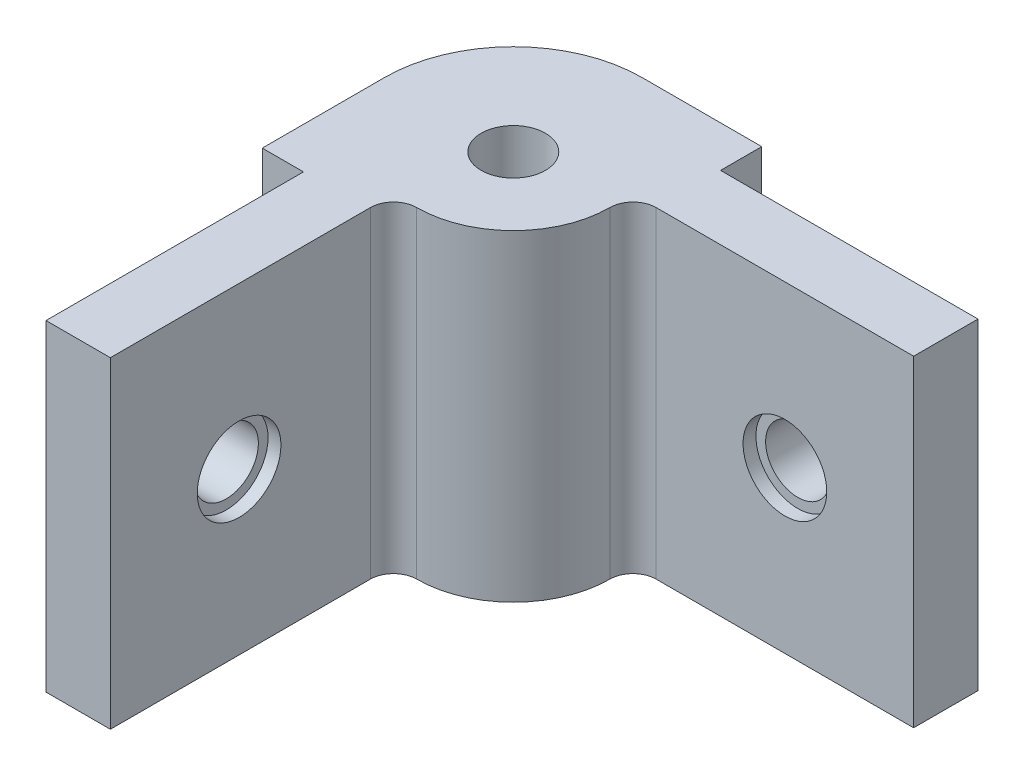
ISO-10303-21;
HEADER;
FILE_DESCRIPTION(('STEP AP214'),'2;1');
FILE_NAME('part.step','',(''),(''),'','','');
FILE_SCHEMA(('AUTOMOTIVE_DESIGN { 1 0 10303 214 1 1 1 1 }'));
ENDSEC;
DATA;
#1=APPLICATION_CONTEXT('core data for automotive mechanical design processes');
#2=APPLICATION_PROTOCOL_DEFINITION('international standard','automotive_design',2000,#1);
#3=PRODUCT_CONTEXT('',#1,'mechanical');
#4=PRODUCT('Part','Part','',(#3));
#5=PRODUCT_RELATED_PRODUCT_CATEGORY('part','',(#4));
#6=PRODUCT_DEFINITION_FORMATION('','',#4);
#7=PRODUCT_DEFINITION_CONTEXT('part definition',#1,'design');
#8=PRODUCT_DEFINITION('design','',#6,#7);
#9=PRODUCT_DEFINITION_SHAPE('','',#8);
#10=(LENGTH_UNIT() NAMED_UNIT(*) SI_UNIT(.MILLI.,.METRE.));
#11=(NAMED_UNIT(*) PLANE_ANGLE_UNIT() SI_UNIT($,.RADIAN.));
#12=(NAMED_UNIT(*) SI_UNIT($,.STERADIAN.) SOLID_ANGLE_UNIT());
#13=UNCERTAINTY_MEASURE_WITH_UNIT(LENGTH_MEASURE(1.E-05),#10,'distance_accuracy_value','');
#14=(GEOMETRIC_REPRESENTATION_CONTEXT(3) GLOBAL_UNCERTAINTY_ASSIGNED_CONTEXT((#13)) GLOBAL_UNIT_ASSIGNED_CONTEXT((#10,
#11,#12)) REPRESENTATION_CONTEXT('',''));
#15=CARTESIAN_POINT('',(0.,0.,0.));
#16=DIRECTION('',(0.,0.,1.));
#17=DIRECTION('',(1.,0.,0.));
#18=AXIS2_PLACEMENT_3D('',#15,#16,#17);
#19=CARTESIAN_POINT('',(-6.44034826133112,12.5,6.99883601694872));
#20=DIRECTION('',(1.,0.,0.));
#21=DIRECTION('',(0.,0.,-1.));
#22=AXIS2_PLACEMENT_3D('',#19,#20,#21);
#23=CYLINDRICAL_SURFACE('',#22,2.5);
#24=CARTESIAN_POINT('',(-3.24034826133112,12.5,6.99883601694872));
#25=DIRECTION('',(1.,0.,0.));
#26=DIRECTION('',(0.,0.,-1.));
#27=AXIS2_PLACEMENT_3D('',#24,#25,#26);
#28=CIRCLE('',#27,2.5);
#29=CARTESIAN_POINT('',(-3.24034826133112,12.5,4.49883601694872));
#30=VERTEX_POINT('',#29);
#31=EDGE_CURVE('E241',#30,#30,#28,.T.);
#32=ORIENTED_EDGE('',*,*,#31,.F.);
#33=EDGE_LOOP('',(#32));
#34=FACE_BOUND('',#33,.T.);
#35=CARTESIAN_POINT('',(0.759651738668881,12.5,6.99883601694872));
#36=DIRECTION('',(1.,0.,0.));
#37=DIRECTION('',(0.,0.,-1.));
#38=AXIS2_PLACEMENT_3D('',#35,#36,#37);
#39=CIRCLE('',#38,2.5);
#40=CARTESIAN_POINT('',(0.759651738668881,12.5,4.49883601694872));
#41=VERTEX_POINT('',#40);
#42=EDGE_CURVE('E38',#41,#41,#39,.F.);
#43=ORIENTED_EDGE('',*,*,#42,.F.);
#44=EDGE_LOOP('',(#43));
#45=FACE_BOUND('',#44,.T.);
#46=ADVANCED_FACE('F34',(#34,#45),#23,.F.);
#47=CARTESIAN_POINT('',(22.8596517386988,12.5,16.9988360169487));
#48=DIRECTION('',(0.,0.,-1.));
#49=DIRECTION('',(-1.,0.,0.));
#50=AXIS2_PLACEMENT_3D('',#47,#48,#49);
#51=CYLINDRICAL_SURFACE('',#50,2.50000000000001);
#52=CARTESIAN_POINT('',(22.8596517386988,12.5,-19.3011639830492));
#53=DIRECTION('',(0.,0.,-1.));
#54=DIRECTION('',(-1.,0.,0.));
#55=AXIS2_PLACEMENT_3D('',#52,#53,#54);
#56=CIRCLE('',#55,2.50000000000001);
#57=CARTESIAN_POINT('',(20.3596517386988,12.5,-19.3011639830492));
#58=VERTEX_POINT('',#57);
#59=EDGE_CURVE('E228',#58,#58,#56,.T.);
#60=ORIENTED_EDGE('',*,*,#59,.T.);
#61=EDGE_LOOP('',(#60));
#62=FACE_BOUND('',#61,.T.);
#63=CARTESIAN_POINT('',(22.8596517386988,12.5,-15.3011639830541));
#64=DIRECTION('',(0.,0.,1.));
#65=DIRECTION('',(1.,0.,0.));
#66=AXIS2_PLACEMENT_3D('',#63,#64,#65);
#67=CIRCLE('',#66,2.50000000000001);
#68=CARTESIAN_POINT('',(25.3596517386988,12.5,-15.3011639830541));
#69=VERTEX_POINT('',#68);
#70=EDGE_CURVE('E226',#69,#69,#67,.F.);
#71=ORIENTED_EDGE('',*,*,#70,.F.);
#72=EDGE_LOOP('',(#71));
#73=FACE_BOUND('',#72,.T.);
#74=ADVANCED_FACE('F299',(#62,#73),#51,.F.);
#75=CARTESIAN_POINT('',(3.55965173866673,25.,-3.20116398305856));
#76=DIRECTION('',(0.,1.,0.));
#77=DIRECTION('',(0.,0.,1.));
#78=AXIS2_PLACEMENT_3D('',#75,#76,#77);
#79=PLANE('',#78);
#80=DIRECTION('',(1.,0.,0.));
#81=VECTOR('',#80,1.);
#82=CARTESIAN_POINT('',(-6.44034826133112,25.,-3.00116398305128));
#83=LINE('',#82,#81);
#84=CARTESIAN_POINT('',(-6.44034826133112,25.,-3.00116398305128));
#85=VERTEX_POINT('',#84);
#86=CARTESIAN_POINT('',(-3.24034826133112,25.,-3.00116398305128));
#87=VERTEX_POINT('',#86);
#88=EDGE_CURVE('E197',#85,#87,#83,.T.);
#89=ORIENTED_EDGE('',*,*,#88,.T.);
#90=DIRECTION('',(0.,0.,1.));
#91=VECTOR('',#90,1.);
#92=CARTESIAN_POINT('',(-3.24034826133112,25.,-3.00116398305128));
#93=LINE('',#92,#91);
#94=CARTESIAN_POINT('',(-3.24034826133112,25.,16.9988360169487));
#95=VERTEX_POINT('',#94);
#96=EDGE_CURVE('E114',#87,#95,#93,.T.);
#97=ORIENTED_EDGE('',*,*,#96,.T.);
#98=DIRECTION('',(1.,0.,0.));
#99=VECTOR('',#98,1.);
#100=CARTESIAN_POINT('',(-3.24034826133112,25.,16.9988360169487));
#101=LINE('',#100,#99);
#102=CARTESIAN_POINT('',(1.75965173866888,25.,16.9988360169487));
#103=VERTEX_POINT('',#102);
#104=EDGE_CURVE('E252',#95,#103,#101,.T.);
#105=ORIENTED_EDGE('',*,*,#104,.T.);
#106=DIRECTION('',(0.,0.,-1.));
#107=VECTOR('',#106,1.);
#108=CARTESIAN_POINT('',(1.75965173866888,25.,-3.20116398305856));
#109=LINE('',#108,#107);
#110=CARTESIAN_POINT('',(1.75965173866888,25.,-3.20116398305856));
#111=VERTEX_POINT('',#110);
#112=EDGE_CURVE('E254',#103,#111,#109,.T.);
#113=ORIENTED_EDGE('',*,*,#112,.T.);
#114=CARTESIAN_POINT('',(3.55965173866673,25.,-3.20116398305856));
#115=DIRECTION('',(0.,-1.,0.));
#116=DIRECTION('',(0.,0.,1.));
#117=AXIS2_PLACEMENT_3D('',#114,#115,#116);
#118=CIRCLE('',#117,1.79999999999785);
#119=CARTESIAN_POINT('',(3.55965173866673,25.,-5.00116398305641));
#120=VERTEX_POINT('',#119);
#121=EDGE_CURVE('E256',#111,#120,#118,.T.);
#122=ORIENTED_EDGE('',*,*,#121,.T.);
#123=CARTESIAN_POINT('',(3.55965173866673,25.,-12.5011639830562));
#124=DIRECTION('',(0.,1.,0.));
#125=DIRECTION('',(0.,0.,-1.));
#126=AXIS2_PLACEMENT_3D('',#123,#124,#125);
#127=CIRCLE('',#126,7.49999999999982);
#128=CARTESIAN_POINT('',(11.0596517386666,25.,-12.5011639830562));
#129=VERTEX_POINT('',#128);
#130=EDGE_CURVE('E258',#120,#129,#127,.T.);
#131=ORIENTED_EDGE('',*,*,#130,.T.);
#132=CARTESIAN_POINT('',(12.8596517386644,25.,-12.5011639830562));
#133=DIRECTION('',(0.,-1.,0.));
#134=DIRECTION('',(0.,0.,-1.));
#135=AXIS2_PLACEMENT_3D('',#132,#133,#134);
#136=CIRCLE('',#135,1.79999999999785);
#137=CARTESIAN_POINT('',(12.8596517386644,25.,-14.3011639830541));
#138=VERTEX_POINT('',#137);
#139=EDGE_CURVE('E260',#129,#138,#136,.T.);
#140=ORIENTED_EDGE('',*,*,#139,.T.);
#141=DIRECTION('',(1.,0.,0.));
#142=VECTOR('',#141,1.);
#143=CARTESIAN_POINT('',(12.8596517386644,25.,-14.3011639830541));
#144=LINE('',#143,#142);
#145=CARTESIAN_POINT('',(32.8596517386987,25.,-14.3011639830541));
#146=VERTEX_POINT('',#145);
#147=EDGE_CURVE('E262',#138,#146,#144,.T.);
#148=ORIENTED_EDGE('',*,*,#147,.T.);
#149=DIRECTION('',(0.,0.,-1.));
#150=VECTOR('',#149,1.);
#151=CARTESIAN_POINT('',(32.8596517386987,25.,-19.3011639830492));
#152=LINE('',#151,#150);
#153=CARTESIAN_POINT('',(32.8596517386987,25.,-19.3011639830492));
#154=VERTEX_POINT('',#153);
#155=EDGE_CURVE('E264',#146,#154,#152,.T.);
#156=ORIENTED_EDGE('',*,*,#155,.T.);
#157=DIRECTION('',(-1.,0.,0.));
#158=VECTOR('',#157,1.);
#159=CARTESIAN_POINT('',(12.8596517386989,25.,-19.3011639830492));
#160=LINE('',#159,#158);
#161=CARTESIAN_POINT('',(12.8596517386989,25.,-19.3011639830492));
#162=VERTEX_POINT('',#161);
#163=EDGE_CURVE('E266',#154,#162,#160,.T.);
#164=ORIENTED_EDGE('',*,*,#163,.T.);
#165=DIRECTION('',(0.,0.,-1.));
#166=VECTOR('',#165,1.);
#167=CARTESIAN_POINT('',(12.8596517386989,25.,-22.5011639830541));
#168=LINE('',#167,#166);
#169=CARTESIAN_POINT('',(12.8596517386989,25.,-22.5011639830541));
#170=VERTEX_POINT('',#169);
#171=EDGE_CURVE('E152',#162,#170,#168,.T.);
#172=ORIENTED_EDGE('',*,*,#171,.T.);
#173=DIRECTION('',(-1.,0.,0.));
#174=VECTOR('',#173,1.);
#175=CARTESIAN_POINT('',(3.55965173866673,25.,-22.5011639830541));
#176=LINE('',#175,#174);
#177=CARTESIAN_POINT('',(3.55965173866673,25.,-22.5011639830541));
#178=VERTEX_POINT('',#177);
#179=EDGE_CURVE('E145',#170,#178,#176,.T.);
#180=ORIENTED_EDGE('',*,*,#179,.T.);
#181=CARTESIAN_POINT('',(3.55965173866673,25.,-12.5011639830562));
#182=DIRECTION('',(0.,1.,0.));
#183=DIRECTION('',(0.,0.,1.));
#184=AXIS2_PLACEMENT_3D('',#181,#182,#183);
#185=CIRCLE('',#184,9.99999999999785);
#186=CARTESIAN_POINT('',(-6.44034826133112,25.,-12.5011639830562));
#187=VERTEX_POINT('',#186);
#188=EDGE_CURVE('E150',#178,#187,#185,.T.);
#189=ORIENTED_EDGE('',*,*,#188,.T.);
#190=DIRECTION('',(0.,0.,1.));
#191=VECTOR('',#190,1.);
#192=CARTESIAN_POINT('',(-6.44034826133112,25.,-12.5011639830562));
#193=LINE('',#192,#191);
#194=EDGE_CURVE('E53',#187,#85,#193,.T.);
#195=ORIENTED_EDGE('',*,*,#194,.T.);
#196=EDGE_LOOP('',(#89,#97,#105,#113,#122,#131,#140,#148,#156,#164,#172,#180,#189,#195));
#197=FACE_BOUND('',#196,.T.);
#198=CARTESIAN_POINT('',(3.55965173866673,25.,-12.5011639830562));
#199=DIRECTION('',(0.,1.,0.));
#200=DIRECTION('',(0.,0.,1.));
#201=AXIS2_PLACEMENT_3D('',#198,#199,#200);
#202=CIRCLE('',#201,2.50000000000224);
#203=CARTESIAN_POINT('',(3.55965173866673,25.,-10.001163983054));
#204=VERTEX_POINT('',#203);
#205=EDGE_CURVE('E174',#204,#204,#202,.T.);
#206=ORIENTED_EDGE('',*,*,#205,.F.);
#207=EDGE_LOOP('',(#206));
#208=FACE_BOUND('',#207,.T.);
#209=ADVANCED_FACE('F147',(#197,#208),#79,.T.);
#210=CARTESIAN_POINT('',(3.55965173866673,0.,-3.20116398305856));
#211=DIRECTION('',(0.,1.,0.));
#212=DIRECTION('',(0.,0.,1.));
#213=AXIS2_PLACEMENT_3D('',#210,#211,#212);
#214=PLANE('',#213);
#215=DIRECTION('',(1.,0.,0.));
#216=VECTOR('',#215,1.);
#217=CARTESIAN_POINT('',(-6.44034826133112,0.,-3.00116398305128));
#218=LINE('',#217,#216);
#219=CARTESIAN_POINT('',(-6.44034826133112,0.,-3.00116398305128));
#220=VERTEX_POINT('',#219);
#221=CARTESIAN_POINT('',(-3.24034826133112,0.,-3.00116398305128));
#222=VERTEX_POINT('',#221);
#223=EDGE_CURVE('E170',#220,#222,#218,.T.);
#224=ORIENTED_EDGE('',*,*,#223,.F.);
#225=DIRECTION('',(0.,0.,1.));
#226=VECTOR('',#225,1.);
#227=CARTESIAN_POINT('',(-6.44034826133112,0.,-12.5011639830562));
#228=LINE('',#227,#226);
#229=CARTESIAN_POINT('',(-6.44034826133112,0.,-12.5011639830562));
#230=VERTEX_POINT('',#229);
#231=EDGE_CURVE('E106',#230,#220,#228,.T.);
#232=ORIENTED_EDGE('',*,*,#231,.F.);
#233=CARTESIAN_POINT('',(3.55965173866673,0.,-12.5011639830562));
#234=DIRECTION('',(0.,1.,0.));
#235=DIRECTION('',(0.,0.,1.));
#236=AXIS2_PLACEMENT_3D('',#233,#234,#235);
#237=CIRCLE('',#236,9.99999999999785);
#238=CARTESIAN_POINT('',(3.55965173866673,0.,-22.5011639830541));
#239=VERTEX_POINT('',#238);
#240=EDGE_CURVE('E100',#239,#230,#237,.T.);
#241=ORIENTED_EDGE('',*,*,#240,.F.);
#242=DIRECTION('',(-1.,0.,0.));
#243=VECTOR('',#242,1.);
#244=CARTESIAN_POINT('',(3.55965173866673,0.,-22.5011639830541));
#245=LINE('',#244,#243);
#246=CARTESIAN_POINT('',(12.8596517386989,0.,-22.5011639830541));
#247=VERTEX_POINT('',#246);
#248=EDGE_CURVE('E160',#247,#239,#245,.T.);
#249=ORIENTED_EDGE('',*,*,#248,.F.);
#250=DIRECTION('',(0.,0.,-1.));
#251=VECTOR('',#250,1.);
#252=CARTESIAN_POINT('',(12.8596517386989,0.,-22.5011639830541));
#253=LINE('',#252,#251);
#254=CARTESIAN_POINT('',(12.8596517386989,0.,-19.3011639830492));
#255=VERTEX_POINT('',#254);
#256=EDGE_CURVE('E192',#255,#247,#253,.T.);
#257=ORIENTED_EDGE('',*,*,#256,.F.);
#258=DIRECTION('',(-1.,0.,0.));
#259=VECTOR('',#258,1.);
#260=CARTESIAN_POINT('',(12.8596517386989,0.,-19.3011639830492));
#261=LINE('',#260,#259);
#262=CARTESIAN_POINT('',(32.8596517386987,0.,-19.3011639830492));
#263=VERTEX_POINT('',#262);
#264=EDGE_CURVE('E190',#263,#255,#261,.T.);
#265=ORIENTED_EDGE('',*,*,#264,.F.);
#266=DIRECTION('',(0.,0.,-1.));
#267=VECTOR('',#266,1.);
#268=CARTESIAN_POINT('',(32.8596517386987,0.,-19.3011639830492));
#269=LINE('',#268,#267);
#270=CARTESIAN_POINT('',(32.8596517386987,0.,-14.3011639830541));
#271=VERTEX_POINT('',#270);
#272=EDGE_CURVE('E188',#271,#263,#269,.T.);
#273=ORIENTED_EDGE('',*,*,#272,.F.);
#274=DIRECTION('',(1.,0.,0.));
#275=VECTOR('',#274,1.);
#276=CARTESIAN_POINT('',(12.8596517386644,0.,-14.3011639830541));
#277=LINE('',#276,#275);
#278=CARTESIAN_POINT('',(12.8596517386644,0.,-14.3011639830541));
#279=VERTEX_POINT('',#278);
#280=EDGE_CURVE('E186',#279,#271,#277,.T.);
#281=ORIENTED_EDGE('',*,*,#280,.F.);
#282=CARTESIAN_POINT('',(12.8596517386644,0.,-12.5011639830562));
#283=DIRECTION('',(0.,-1.,0.));
#284=DIRECTION('',(0.,0.,-1.));
#285=AXIS2_PLACEMENT_3D('',#282,#283,#284);
#286=CIRCLE('',#285,1.79999999999785);
#287=CARTESIAN_POINT('',(11.0596517386666,0.,-12.5011639830562));
#288=VERTEX_POINT('',#287);
#289=EDGE_CURVE('E184',#288,#279,#286,.T.);
#290=ORIENTED_EDGE('',*,*,#289,.F.);
#291=CARTESIAN_POINT('',(3.55965173866673,0.,-12.5011639830562));
#292=DIRECTION('',(0.,1.,0.));
#293=DIRECTION('',(0.,0.,-1.));
#294=AXIS2_PLACEMENT_3D('',#291,#292,#293);
#295=CIRCLE('',#294,7.49999999999982);
#296=CARTESIAN_POINT('',(3.55965173866673,0.,-5.00116398305641));
#297=VERTEX_POINT('',#296);
#298=EDGE_CURVE('E182',#297,#288,#295,.T.);
#299=ORIENTED_EDGE('',*,*,#298,.F.);
#300=CARTESIAN_POINT('',(3.55965173866673,0.,-3.20116398305856));
#301=DIRECTION('',(0.,-1.,0.));
#302=DIRECTION('',(0.,0.,1.));
#303=AXIS2_PLACEMENT_3D('',#300,#301,#302);
#304=CIRCLE('',#303,1.79999999999785);
#305=CARTESIAN_POINT('',(1.75965173866888,0.,-3.20116398305856));
#306=VERTEX_POINT('',#305);
#307=EDGE_CURVE('E180',#306,#297,#304,.T.);
#308=ORIENTED_EDGE('',*,*,#307,.F.);
#309=DIRECTION('',(0.,0.,-1.));
#310=VECTOR('',#309,1.);
#311=CARTESIAN_POINT('',(1.75965173866888,0.,-3.20116398305856));
#312=LINE('',#311,#310);
#313=CARTESIAN_POINT('',(1.75965173866888,0.,16.9988360169487));
#314=VERTEX_POINT('',#313);
#315=EDGE_CURVE('E178',#314,#306,#312,.T.);
#316=ORIENTED_EDGE('',*,*,#315,.F.);
#317=DIRECTION('',(1.,0.,0.));
#318=VECTOR('',#317,1.);
#319=CARTESIAN_POINT('',(-3.24034826133112,0.,16.9988360169487));
#320=LINE('',#319,#318);
#321=CARTESIAN_POINT('',(-3.24034826133112,0.,16.9988360169487));
#322=VERTEX_POINT('',#321);
#323=EDGE_CURVE('E176',#322,#314,#320,.T.);
#324=ORIENTED_EDGE('',*,*,#323,.F.);
#325=DIRECTION('',(0.,0.,1.));
#326=VECTOR('',#325,1.);
#327=CARTESIAN_POINT('',(-3.24034826133112,0.,-3.00116398305128));
#328=LINE('',#327,#326);
#329=EDGE_CURVE('E173',#222,#322,#328,.T.);
#330=ORIENTED_EDGE('',*,*,#329,.F.);
#331=EDGE_LOOP('',(#224,#232,#241,#249,#257,#265,#273,#281,#290,#299,#308,#316,#324,#330));
#332=FACE_BOUND('',#331,.T.);
#333=CARTESIAN_POINT('',(3.55965173866673,0.,-12.5011639830562));
#334=DIRECTION('',(0.,1.,0.));
#335=DIRECTION('',(0.,0.,1.));
#336=AXIS2_PLACEMENT_3D('',#333,#334,#335);
#337=CIRCLE('',#336,2.50000000000224);
#338=CARTESIAN_POINT('',(3.55965173866673,0.,-10.001163983054));
#339=VERTEX_POINT('',#338);
#340=EDGE_CURVE('E233',#339,#339,#337,.T.);
#341=ORIENTED_EDGE('',*,*,#340,.T.);
#342=EDGE_LOOP('',(#341));
#343=FACE_BOUND('',#342,.T.);
#344=ADVANCED_FACE('F279',(#332,#343),#214,.F.);
#345=CARTESIAN_POINT('',(-6.44034826133112,25.,-3.00116398305128));
#346=DIRECTION('',(0.,0.,-1.));
#347=DIRECTION('',(-1.,0.,0.));
#348=AXIS2_PLACEMENT_3D('',#345,#346,#347);
#349=PLANE('',#348);
#350=ORIENTED_EDGE('',*,*,#223,.T.);
#351=DIRECTION('',(0.,-1.,0.));
#352=VECTOR('',#351,1.);
#353=CARTESIAN_POINT('',(-3.24034826133112,25.,-3.00116398305128));
#354=LINE('',#353,#352);
#355=EDGE_CURVE('E11',#87,#222,#354,.T.);
#356=ORIENTED_EDGE('',*,*,#355,.F.);
#357=ORIENTED_EDGE('',*,*,#88,.F.);
#358=DIRECTION('',(0.,-1.,0.));
#359=VECTOR('',#358,1.);
#360=CARTESIAN_POINT('',(-6.44034826133112,25.,-3.00116398305128));
#361=LINE('',#360,#359);
#362=EDGE_CURVE('E166',#85,#220,#361,.T.);
#363=ORIENTED_EDGE('',*,*,#362,.T.);
#364=EDGE_LOOP('',(#350,#356,#357,#363));
#365=FACE_BOUND('',#364,.T.);
#366=ADVANCED_FACE('F36',(#365),#349,.F.);
#367=CARTESIAN_POINT('',(-3.24034826133112,25.,-3.00116398305128));
#368=DIRECTION('',(1.,0.,0.));
#369=DIRECTION('',(0.,0.,-1.));
#370=AXIS2_PLACEMENT_3D('',#367,#368,#369);
#371=PLANE('',#370);
#372=ORIENTED_EDGE('',*,*,#31,.T.);
#373=EDGE_LOOP('',(#372));
#374=FACE_BOUND('',#373,.T.);
#375=ORIENTED_EDGE('',*,*,#329,.T.);
#376=DIRECTION('',(0.,-1.,0.));
#377=VECTOR('',#376,1.);
#378=CARTESIAN_POINT('',(-3.24034826133112,25.,16.9988360169487));
#379=LINE('',#378,#377);
#380=EDGE_CURVE('E44',#95,#322,#379,.T.);
#381=ORIENTED_EDGE('',*,*,#380,.F.);
#382=ORIENTED_EDGE('',*,*,#96,.F.);
#383=ORIENTED_EDGE('',*,*,#355,.T.);
#384=EDGE_LOOP('',(#375,#381,#382,#383));
#385=FACE_BOUND('',#384,.T.);
#386=ADVANCED_FACE('F325',(#374,#385),#371,.F.);
#387=CARTESIAN_POINT('',(-3.24034826133112,25.,16.9988360169487));
#388=DIRECTION('',(0.,0.,-1.));
#389=DIRECTION('',(-1.,0.,0.));
#390=AXIS2_PLACEMENT_3D('',#387,#388,#389);
#391=PLANE('',#390);
#392=ORIENTED_EDGE('',*,*,#323,.T.);
#393=DIRECTION('',(0.,-1.,0.));
#394=VECTOR('',#393,1.);
#395=CARTESIAN_POINT('',(1.75965173866888,25.,16.9988360169487));
#396=LINE('',#395,#394);
#397=EDGE_CURVE('E222',#103,#314,#396,.T.);
#398=ORIENTED_EDGE('',*,*,#397,.F.);
#399=ORIENTED_EDGE('',*,*,#104,.F.);
#400=ORIENTED_EDGE('',*,*,#380,.T.);
#401=EDGE_LOOP('',(#392,#398,#399,#400));
#402=FACE_BOUND('',#401,.T.);
#403=ADVANCED_FACE('F329',(#402),#391,.F.);
#404=CARTESIAN_POINT('',(1.75965173866888,25.,-3.20116398305856));
#405=DIRECTION('',(-1.,0.,0.));
#406=DIRECTION('',(0.,0.,1.));
#407=AXIS2_PLACEMENT_3D('',#404,#405,#406);
#408=PLANE('',#407);
#409=CARTESIAN_POINT('',(1.75965173866888,12.5,6.99883601694872));
#410=DIRECTION('',(1.,0.,0.));
#411=DIRECTION('',(0.,0.,-1.));
#412=AXIS2_PLACEMENT_3D('',#409,#410,#411);
#413=CIRCLE('',#412,3.25);
#414=CARTESIAN_POINT('',(1.75965173866888,12.5,3.74883601694872));
#415=VERTEX_POINT('',#414);
#416=EDGE_CURVE('E462',#415,#415,#413,.T.);
#417=ORIENTED_EDGE('',*,*,#416,.F.);
#418=EDGE_LOOP('',(#417));
#419=FACE_BOUND('',#418,.T.);
#420=ORIENTED_EDGE('',*,*,#315,.T.);
#421=DIRECTION('',(0.,-1.,0.));
#422=VECTOR('',#421,1.);
#423=CARTESIAN_POINT('',(1.75965173866888,25.,-3.20116398305856));
#424=LINE('',#423,#422);
#425=EDGE_CURVE('E219',#111,#306,#424,.T.);
#426=ORIENTED_EDGE('',*,*,#425,.F.);
#427=ORIENTED_EDGE('',*,*,#112,.F.);
#428=ORIENTED_EDGE('',*,*,#397,.T.);
#429=EDGE_LOOP('',(#420,#426,#427,#428));
#430=FACE_BOUND('',#429,.T.);
#431=ADVANCED_FACE('F334',(#419,#430),#408,.F.);
#432=CARTESIAN_POINT('',(3.55965173866673,25.,-3.20116398305856));
#433=DIRECTION('',(0.,-1.,0.));
#434=DIRECTION('',(0.,0.,-1.));
#435=AXIS2_PLACEMENT_3D('',#432,#433,#434);
#436=CYLINDRICAL_SURFACE('',#435,1.79999999999785);
#437=ORIENTED_EDGE('',*,*,#307,.T.);
#438=DIRECTION('',(0.,-1.,0.));
#439=VECTOR('',#438,1.);
#440=CARTESIAN_POINT('',(3.55965173866673,25.,-5.00116398305641));
#441=LINE('',#440,#439);
#442=EDGE_CURVE('E216',#120,#297,#441,.T.);
#443=ORIENTED_EDGE('',*,*,#442,.F.);
#444=ORIENTED_EDGE('',*,*,#121,.F.);
#445=ORIENTED_EDGE('',*,*,#425,.T.);
#446=EDGE_LOOP('',(#437,#443,#444,#445));
#447=FACE_BOUND('',#446,.T.);
#448=ADVANCED_FACE('F341',(#447),#436,.F.);
#449=CARTESIAN_POINT('',(3.55965173866673,25.,-12.5011639830562));
#450=DIRECTION('',(0.,-1.,0.));
#451=DIRECTION('',(0.,0.,-1.));
#452=AXIS2_PLACEMENT_3D('',#449,#450,#451);
#453=CYLINDRICAL_SURFACE('',#452,7.49999999999982);
#454=ORIENTED_EDGE('',*,*,#298,.T.);
#455=DIRECTION('',(0.,-1.,0.));
#456=VECTOR('',#455,1.);
#457=CARTESIAN_POINT('',(11.0596517386666,25.,-12.5011639830562));
#458=LINE('',#457,#456);
#459=EDGE_CURVE('E213',#129,#288,#458,.T.);
#460=ORIENTED_EDGE('',*,*,#459,.F.);
#461=ORIENTED_EDGE('',*,*,#130,.F.);
#462=ORIENTED_EDGE('',*,*,#442,.T.);
#463=EDGE_LOOP('',(#454,#460,#461,#462));
#464=FACE_BOUND('',#463,.T.);
#465=ADVANCED_FACE('F345',(#464),#453,.T.);
#466=CARTESIAN_POINT('',(12.8596517386644,25.,-12.5011639830562));
#467=DIRECTION('',(0.,-1.,0.));
#468=DIRECTION('',(0.,0.,-1.));
#469=AXIS2_PLACEMENT_3D('',#466,#467,#468);
#470=CYLINDRICAL_SURFACE('',#469,1.79999999999785);
#471=ORIENTED_EDGE('',*,*,#289,.T.);
#472=DIRECTION('',(0.,-1.,0.));
#473=VECTOR('',#472,1.);
#474=CARTESIAN_POINT('',(12.8596517386644,25.,-14.3011639830541));
#475=LINE('',#474,#473);
#476=EDGE_CURVE('E210',#138,#279,#475,.T.);
#477=ORIENTED_EDGE('',*,*,#476,.F.);
#478=ORIENTED_EDGE('',*,*,#139,.F.);
#479=ORIENTED_EDGE('',*,*,#459,.T.);
#480=EDGE_LOOP('',(#471,#477,#478,#479));
#481=FACE_BOUND('',#480,.T.);
#482=ADVANCED_FACE('F349',(#481),#470,.F.);
#483=CARTESIAN_POINT('',(12.8596517386644,25.,-14.3011639830541));
#484=DIRECTION('',(0.,0.,-1.));
#485=DIRECTION('',(-1.,0.,0.));
#486=AXIS2_PLACEMENT_3D('',#483,#484,#485);
#487=PLANE('',#486);
#488=CARTESIAN_POINT('',(22.8596517386988,12.5,-14.3011639830541));
#489=DIRECTION('',(0.,0.,1.));
#490=DIRECTION('',(1.,0.,0.));
#491=AXIS2_PLACEMENT_3D('',#488,#489,#490);
#492=CIRCLE('',#491,3.25);
#493=CARTESIAN_POINT('',(26.1096517386988,12.5,-14.3011639830541));
#494=VERTEX_POINT('',#493);
#495=EDGE_CURVE('E236',#494,#494,#492,.T.);
#496=ORIENTED_EDGE('',*,*,#495,.F.);
#497=EDGE_LOOP('',(#496));
#498=FACE_BOUND('',#497,.T.);
#499=ORIENTED_EDGE('',*,*,#280,.T.);
#500=DIRECTION('',(0.,-1.,0.));
#501=VECTOR('',#500,1.);
#502=CARTESIAN_POINT('',(32.8596517386987,25.,-14.3011639830541));
#503=LINE('',#502,#501);
#504=EDGE_CURVE('E207',#146,#271,#503,.T.);
#505=ORIENTED_EDGE('',*,*,#504,.F.);
#506=ORIENTED_EDGE('',*,*,#147,.F.);
#507=ORIENTED_EDGE('',*,*,#476,.T.);
#508=EDGE_LOOP('',(#499,#505,#506,#507));
#509=FACE_BOUND('',#508,.T.);
#510=ADVANCED_FACE('F353',(#498,#509),#487,.F.);
#511=CARTESIAN_POINT('',(32.8596517386987,25.,-19.3011639830492));
#512=DIRECTION('',(-1.,0.,0.));
#513=DIRECTION('',(0.,0.,1.));
#514=AXIS2_PLACEMENT_3D('',#511,#512,#513);
#515=PLANE('',#514);
#516=ORIENTED_EDGE('',*,*,#272,.T.);
#517=DIRECTION('',(0.,-1.,0.));
#518=VECTOR('',#517,1.);
#519=CARTESIAN_POINT('',(32.8596517386987,25.,-19.3011639830492));
#520=LINE('',#519,#518);
#521=EDGE_CURVE('E204',#154,#263,#520,.T.);
#522=ORIENTED_EDGE('',*,*,#521,.F.);
#523=ORIENTED_EDGE('',*,*,#155,.F.);
#524=ORIENTED_EDGE('',*,*,#504,.T.);
#525=EDGE_LOOP('',(#516,#522,#523,#524));
#526=FACE_BOUND('',#525,.T.);
#527=ADVANCED_FACE('F357',(#526),#515,.F.);
#528=CARTESIAN_POINT('',(12.8596517386989,25.,-19.3011639830492));
#529=DIRECTION('',(0.,0.,1.));
#530=DIRECTION('',(1.,0.,0.));
#531=AXIS2_PLACEMENT_3D('',#528,#529,#530);
#532=PLANE('',#531);
#533=ORIENTED_EDGE('',*,*,#59,.F.);
#534=EDGE_LOOP('',(#533));
#535=FACE_BOUND('',#534,.T.);
#536=ORIENTED_EDGE('',*,*,#264,.T.);
#537=DIRECTION('',(0.,-1.,0.));
#538=VECTOR('',#537,1.);
#539=CARTESIAN_POINT('',(12.8596517386989,25.,-19.3011639830492));
#540=LINE('',#539,#538);
#541=EDGE_CURVE('E201',#162,#255,#540,.T.);
#542=ORIENTED_EDGE('',*,*,#541,.F.);
#543=ORIENTED_EDGE('',*,*,#163,.F.);
#544=ORIENTED_EDGE('',*,*,#521,.T.);
#545=EDGE_LOOP('',(#536,#542,#543,#544));
#546=FACE_BOUND('',#545,.T.);
#547=ADVANCED_FACE('F272',(#535,#546),#532,.F.);
#548=CARTESIAN_POINT('',(12.8596517386989,25.,-22.5011639830541));
#549=DIRECTION('',(-1.,0.,0.));
#550=DIRECTION('',(0.,0.,1.));
#551=AXIS2_PLACEMENT_3D('',#548,#549,#550);
#552=PLANE('',#551);
#553=ORIENTED_EDGE('',*,*,#256,.T.);
#554=DIRECTION('',(0.,-1.,0.));
#555=VECTOR('',#554,1.);
#556=CARTESIAN_POINT('',(12.8596517386989,25.,-22.5011639830541));
#557=LINE('',#556,#555);
#558=EDGE_CURVE('E161',#170,#247,#557,.T.);
#559=ORIENTED_EDGE('',*,*,#558,.F.);
#560=ORIENTED_EDGE('',*,*,#171,.F.);
#561=ORIENTED_EDGE('',*,*,#541,.T.);
#562=EDGE_LOOP('',(#553,#559,#560,#561));
#563=FACE_BOUND('',#562,.T.);
#564=ADVANCED_FACE('F276',(#563),#552,.F.);
#565=CARTESIAN_POINT('',(3.55965173866673,25.,-22.5011639830541));
#566=DIRECTION('',(0.,0.,1.));
#567=DIRECTION('',(1.,0.,0.));
#568=AXIS2_PLACEMENT_3D('',#565,#566,#567);
#569=PLANE('',#568);
#570=ORIENTED_EDGE('',*,*,#248,.T.);
#571=DIRECTION('',(0.,-1.,0.));
#572=VECTOR('',#571,1.);
#573=CARTESIAN_POINT('',(3.55965173866673,25.,-22.5011639830541));
#574=LINE('',#573,#572);
#575=EDGE_CURVE('E157',#178,#239,#574,.T.);
#576=ORIENTED_EDGE('',*,*,#575,.F.);
#577=ORIENTED_EDGE('',*,*,#179,.F.);
#578=ORIENTED_EDGE('',*,*,#558,.T.);
#579=EDGE_LOOP('',(#570,#576,#577,#578));
#580=FACE_BOUND('',#579,.T.);
#581=ADVANCED_FACE('F158',(#580),#569,.F.);
#582=CARTESIAN_POINT('',(3.55965173866673,25.,-12.5011639830562));
#583=DIRECTION('',(0.,-1.,0.));
#584=DIRECTION('',(0.,0.,-1.));
#585=AXIS2_PLACEMENT_3D('',#582,#583,#584);
#586=CYLINDRICAL_SURFACE('',#585,9.99999999999785);
#587=ORIENTED_EDGE('',*,*,#240,.T.);
#588=DIRECTION('',(0.,-1.,0.));
#589=VECTOR('',#588,1.);
#590=CARTESIAN_POINT('',(-6.44034826133112,25.,-12.5011639830562));
#591=LINE('',#590,#589);
#592=EDGE_CURVE('E162',#187,#230,#591,.T.);
#593=ORIENTED_EDGE('',*,*,#592,.F.);
#594=ORIENTED_EDGE('',*,*,#188,.F.);
#595=ORIENTED_EDGE('',*,*,#575,.T.);
#596=EDGE_LOOP('',(#587,#593,#594,#595));
#597=FACE_BOUND('',#596,.T.);
#598=ADVANCED_FACE('F164',(#597),#586,.T.);
#599=CARTESIAN_POINT('',(-6.44034826133112,25.,-12.5011639830562));
#600=DIRECTION('',(1.,0.,0.));
#601=DIRECTION('',(0.,0.,-1.));
#602=AXIS2_PLACEMENT_3D('',#599,#600,#601);
#603=PLANE('',#602);
#604=ORIENTED_EDGE('',*,*,#231,.T.);
#605=ORIENTED_EDGE('',*,*,#362,.F.);
#606=ORIENTED_EDGE('',*,*,#194,.F.);
#607=ORIENTED_EDGE('',*,*,#592,.T.);
#608=EDGE_LOOP('',(#604,#605,#606,#607));
#609=FACE_BOUND('',#608,.T.);
#610=ADVANCED_FACE('F285',(#609),#603,.F.);
#611=CARTESIAN_POINT('',(3.55965173866673,25.,-12.5011639830562));
#612=DIRECTION('',(0.,-1.,0.));
#613=DIRECTION('',(0.,0.,-1.));
#614=AXIS2_PLACEMENT_3D('',#611,#612,#613);
#615=CYLINDRICAL_SURFACE('',#614,2.50000000000224);
#616=ORIENTED_EDGE('',*,*,#205,.T.);
#617=EDGE_LOOP('',(#616));
#618=FACE_BOUND('',#617,.T.);
#619=ORIENTED_EDGE('',*,*,#340,.F.);
#620=EDGE_LOOP('',(#619));
#621=FACE_BOUND('',#620,.T.);
#622=ADVANCED_FACE('F287',(#618,#621),#615,.F.);
#623=CARTESIAN_POINT('',(22.8596517386988,12.5,-15.3011639830541));
#624=DIRECTION('',(0.,0.,1.));
#625=DIRECTION('',(1.,0.,0.));
#626=AXIS2_PLACEMENT_3D('',#623,#624,#625);
#627=PLANE('',#626);
#628=CARTESIAN_POINT('',(22.8596517386988,12.5,-15.3011639830541));
#629=DIRECTION('',(0.,0.,1.));
#630=DIRECTION('',(1.,0.,0.));
#631=AXIS2_PLACEMENT_3D('',#628,#629,#630);
#632=CIRCLE('',#631,3.25);
#633=CARTESIAN_POINT('',(26.1096517386988,12.5,-15.3011639830541));
#634=VERTEX_POINT('',#633);
#635=EDGE_CURVE('E229',#634,#634,#632,.T.);
#636=ORIENTED_EDGE('',*,*,#635,.T.);
#637=EDGE_LOOP('',(#636));
#638=FACE_BOUND('',#637,.T.);
#639=ORIENTED_EDGE('',*,*,#70,.T.);
#640=EDGE_LOOP('',(#639));
#641=FACE_BOUND('',#640,.T.);
#642=ADVANCED_FACE('F293',(#638,#641),#627,.T.);
#643=CARTESIAN_POINT('',(22.8596517386988,12.5,-15.3011639830541));
#644=DIRECTION('',(0.,0.,1.));
#645=DIRECTION('',(1.,0.,0.));
#646=AXIS2_PLACEMENT_3D('',#643,#644,#645);
#647=CYLINDRICAL_SURFACE('',#646,3.25);
#648=ORIENTED_EDGE('',*,*,#635,.F.);
#649=EDGE_LOOP('',(#648));
#650=FACE_BOUND('',#649,.T.);
#651=ORIENTED_EDGE('',*,*,#495,.T.);
#652=EDGE_LOOP('',(#651));
#653=FACE_BOUND('',#652,.T.);
#654=ADVANCED_FACE('F315',(#650,#653),#647,.F.);
#655=CARTESIAN_POINT('',(0.759651738668881,12.5,6.99883601694872));
#656=DIRECTION('',(1.,0.,0.));
#657=DIRECTION('',(0.,0.,-1.));
#658=AXIS2_PLACEMENT_3D('',#655,#656,#657);
#659=PLANE('',#658);
#660=CARTESIAN_POINT('',(0.759651738668881,12.5,6.99883601694872));
#661=DIRECTION('',(1.,0.,0.));
#662=DIRECTION('',(0.,0.,-1.));
#663=AXIS2_PLACEMENT_3D('',#660,#661,#662);
#664=CIRCLE('',#663,3.25);
#665=CARTESIAN_POINT('',(0.759651738668881,12.5,3.74883601694872));
#666=VERTEX_POINT('',#665);
#667=EDGE_CURVE('E459',#666,#666,#664,.T.);
#668=ORIENTED_EDGE('',*,*,#667,.T.);
#669=EDGE_LOOP('',(#668));
#670=FACE_BOUND('',#669,.T.);
#671=ORIENTED_EDGE('',*,*,#42,.T.);
#672=EDGE_LOOP('',(#671));
#673=FACE_BOUND('',#672,.T.);
#674=ADVANCED_FACE('F317',(#670,#673),#659,.T.);
#675=CARTESIAN_POINT('',(0.759651738668881,12.5,6.99883601694872));
#676=DIRECTION('',(1.,0.,0.));
#677=DIRECTION('',(0.,0.,-1.));
#678=AXIS2_PLACEMENT_3D('',#675,#676,#677);
#679=CYLINDRICAL_SURFACE('',#678,3.25);
#680=ORIENTED_EDGE('',*,*,#667,.F.);
#681=EDGE_LOOP('',(#680));
#682=FACE_BOUND('',#681,.T.);
#683=ORIENTED_EDGE('',*,*,#416,.T.);
#684=EDGE_LOOP('',(#683));
#685=FACE_BOUND('',#684,.T.);
#686=ADVANCED_FACE('F311',(#682,#685),#679,.F.);
#687=CLOSED_SHELL('',(#46,#74,#209,#344,#366,#386,#403,#431,#448,#465,#482,#510,#527,#547,#564,
#581,#598,#610,#622,#642,#654,#674,#686));
#688=MANIFOLD_SOLID_BREP('B2',#687);
#689=ADVANCED_BREP_SHAPE_REPRESENTATION('',(#18,#688),#14);
#690=SHAPE_DEFINITION_REPRESENTATION(#9,#689);
ENDSEC;
END-ISO-10303-21;
